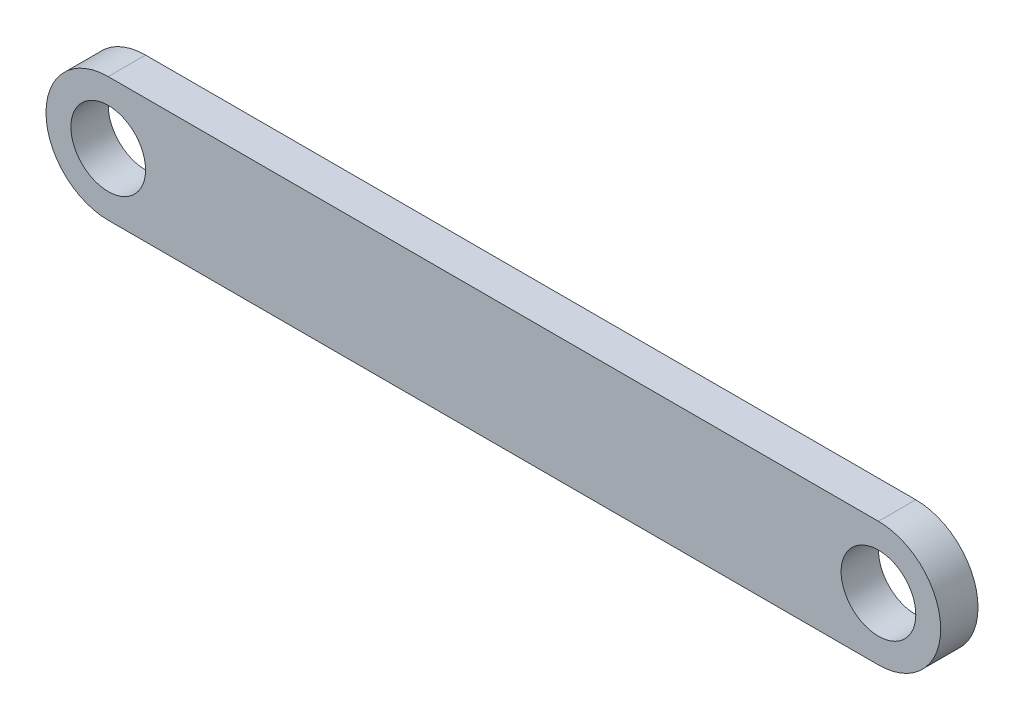
ISO-10303-21;
HEADER;
FILE_DESCRIPTION(('STEP AP214'),'2;1');
FILE_NAME('part.step','',(''),(''),'','','');
FILE_SCHEMA(('AUTOMOTIVE_DESIGN { 1 0 10303 214 1 1 1 1 }'));
ENDSEC;
DATA;
#1=APPLICATION_CONTEXT('core data for automotive mechanical design processes');
#2=APPLICATION_PROTOCOL_DEFINITION('international standard','automotive_design',2000,#1);
#3=PRODUCT_CONTEXT('',#1,'mechanical');
#4=PRODUCT('Part','Part','',(#3));
#5=PRODUCT_RELATED_PRODUCT_CATEGORY('part','',(#4));
#6=PRODUCT_DEFINITION_FORMATION('','',#4);
#7=PRODUCT_DEFINITION_CONTEXT('part definition',#1,'design');
#8=PRODUCT_DEFINITION('design','',#6,#7);
#9=PRODUCT_DEFINITION_SHAPE('','',#8);
#10=(LENGTH_UNIT() NAMED_UNIT(*) SI_UNIT(.MILLI.,.METRE.));
#11=(NAMED_UNIT(*) PLANE_ANGLE_UNIT() SI_UNIT($,.RADIAN.));
#12=(NAMED_UNIT(*) SI_UNIT($,.STERADIAN.) SOLID_ANGLE_UNIT());
#13=UNCERTAINTY_MEASURE_WITH_UNIT(LENGTH_MEASURE(1.E-05),#10,'distance_accuracy_value','');
#14=(GEOMETRIC_REPRESENTATION_CONTEXT(3) GLOBAL_UNCERTAINTY_ASSIGNED_CONTEXT((#13)) GLOBAL_UNIT_ASSIGNED_CONTEXT((#10,
#11,#12)) REPRESENTATION_CONTEXT('',''));
#15=CARTESIAN_POINT('',(0.,0.,0.));
#16=DIRECTION('',(0.,0.,1.));
#17=DIRECTION('',(1.,0.,0.));
#18=AXIS2_PLACEMENT_3D('',#15,#16,#17);
#19=CARTESIAN_POINT('',(-30.95,0.,3.));
#20=DIRECTION('',(0.,0.,1.));
#21=DIRECTION('',(1.,0.,0.));
#22=AXIS2_PLACEMENT_3D('',#19,#20,#21);
#23=PLANE('',#22);
#24=CARTESIAN_POINT('',(-30.95,0.,3.));
#25=DIRECTION('',(0.,0.,1.));
#26=DIRECTION('',(1.,0.,0.));
#27=AXIS2_PLACEMENT_3D('',#24,#25,#26);
#28=CIRCLE('',#27,3.);
#29=CARTESIAN_POINT('',(-27.95,0.,3.));
#30=VERTEX_POINT('',#29);
#31=EDGE_CURVE('E99',#30,#30,#28,.T.);
#32=ORIENTED_EDGE('',*,*,#31,.F.);
#33=EDGE_LOOP('',(#32));
#34=FACE_BOUND('',#33,.T.);
#35=CARTESIAN_POINT('',(-30.95,0.,3.));
#36=DIRECTION('',(0.,0.,1.));
#37=DIRECTION('',(1.,0.,0.));
#38=AXIS2_PLACEMENT_3D('',#35,#36,#37);
#39=CIRCLE('',#38,5.);
#40=CARTESIAN_POINT('',(-30.95,5.,3.));
#41=VERTEX_POINT('',#40);
#42=CARTESIAN_POINT('',(-30.95,-5.,3.));
#43=VERTEX_POINT('',#42);
#44=EDGE_CURVE('E84',#41,#43,#39,.T.);
#45=ORIENTED_EDGE('',*,*,#44,.T.);
#46=DIRECTION('',(1.,0.,0.));
#47=VECTOR('',#46,1.);
#48=CARTESIAN_POINT('',(-30.95,-5.,3.));
#49=LINE('',#48,#47);
#50=CARTESIAN_POINT('',(30.95,-4.99999999999999,3.));
#51=VERTEX_POINT('',#50);
#52=EDGE_CURVE('E79',#43,#51,#49,.T.);
#53=ORIENTED_EDGE('',*,*,#52,.T.);
#54=CARTESIAN_POINT('',(30.95,0.,3.));
#55=DIRECTION('',(0.,0.,1.));
#56=DIRECTION('',(1.,0.,0.));
#57=AXIS2_PLACEMENT_3D('',#54,#55,#56);
#58=CIRCLE('',#57,5.);
#59=CARTESIAN_POINT('',(30.95,5.00000000000001,3.));
#60=VERTEX_POINT('',#59);
#61=EDGE_CURVE('E82',#51,#60,#58,.T.);
#62=ORIENTED_EDGE('',*,*,#61,.T.);
#63=DIRECTION('',(-1.,0.,0.));
#64=VECTOR('',#63,1.);
#65=CARTESIAN_POINT('',(-30.95,5.,3.));
#66=LINE('',#65,#64);
#67=EDGE_CURVE('E49',#60,#41,#66,.T.);
#68=ORIENTED_EDGE('',*,*,#67,.T.);
#69=EDGE_LOOP('',(#45,#53,#62,#68));
#70=FACE_BOUND('',#69,.T.);
#71=CARTESIAN_POINT('',(30.95,0.,3.));
#72=DIRECTION('',(0.,0.,1.));
#73=DIRECTION('',(1.,0.,0.));
#74=AXIS2_PLACEMENT_3D('',#71,#72,#73);
#75=CIRCLE('',#74,3.00000000000001);
#76=CARTESIAN_POINT('',(33.95,0.,3.));
#77=VERTEX_POINT('',#76);
#78=EDGE_CURVE('E114',#77,#77,#75,.T.);
#79=ORIENTED_EDGE('',*,*,#78,.F.);
#80=EDGE_LOOP('',(#79));
#81=FACE_BOUND('',#80,.T.);
#82=ADVANCED_FACE('F32',(#34,#70,#81),#23,.T.);
#83=CARTESIAN_POINT('',(-30.95,0.,0.));
#84=DIRECTION('',(0.,0.,1.));
#85=DIRECTION('',(1.,0.,0.));
#86=AXIS2_PLACEMENT_3D('',#83,#84,#85);
#87=PLANE('',#86);
#88=CARTESIAN_POINT('',(-30.95,0.,0.));
#89=DIRECTION('',(0.,0.,1.));
#90=DIRECTION('',(1.,0.,0.));
#91=AXIS2_PLACEMENT_3D('',#88,#89,#90);
#92=CIRCLE('',#91,5.);
#93=CARTESIAN_POINT('',(-30.95,5.,0.));
#94=VERTEX_POINT('',#93);
#95=CARTESIAN_POINT('',(-30.95,-5.,0.));
#96=VERTEX_POINT('',#95);
#97=EDGE_CURVE('E96',#94,#96,#92,.T.);
#98=ORIENTED_EDGE('',*,*,#97,.F.);
#99=DIRECTION('',(-1.,0.,0.));
#100=VECTOR('',#99,1.);
#101=CARTESIAN_POINT('',(-30.95,5.,0.));
#102=LINE('',#101,#100);
#103=CARTESIAN_POINT('',(30.95,5.00000000000001,0.));
#104=VERTEX_POINT('',#103);
#105=EDGE_CURVE('E72',#104,#94,#102,.T.);
#106=ORIENTED_EDGE('',*,*,#105,.F.);
#107=CARTESIAN_POINT('',(30.95,0.,0.));
#108=DIRECTION('',(0.,0.,1.));
#109=DIRECTION('',(1.,0.,0.));
#110=AXIS2_PLACEMENT_3D('',#107,#108,#109);
#111=CIRCLE('',#110,5.);
#112=CARTESIAN_POINT('',(30.95,-4.99999999999999,0.));
#113=VERTEX_POINT('',#112);
#114=EDGE_CURVE('E66',#113,#104,#111,.T.);
#115=ORIENTED_EDGE('',*,*,#114,.F.);
#116=DIRECTION('',(1.,0.,0.));
#117=VECTOR('',#116,1.);
#118=CARTESIAN_POINT('',(-30.95,-5.,0.));
#119=LINE('',#118,#117);
#120=EDGE_CURVE('E88',#96,#113,#119,.T.);
#121=ORIENTED_EDGE('',*,*,#120,.F.);
#122=EDGE_LOOP('',(#98,#106,#115,#121));
#123=FACE_BOUND('',#122,.T.);
#124=CARTESIAN_POINT('',(-30.95,0.,0.));
#125=DIRECTION('',(0.,0.,1.));
#126=DIRECTION('',(1.,0.,0.));
#127=AXIS2_PLACEMENT_3D('',#124,#125,#126);
#128=CIRCLE('',#127,3.);
#129=CARTESIAN_POINT('',(-27.95,0.,0.));
#130=VERTEX_POINT('',#129);
#131=EDGE_CURVE('E111',#130,#130,#128,.T.);
#132=ORIENTED_EDGE('',*,*,#131,.T.);
#133=EDGE_LOOP('',(#132));
#134=FACE_BOUND('',#133,.T.);
#135=CARTESIAN_POINT('',(30.95,0.,0.));
#136=DIRECTION('',(0.,0.,1.));
#137=DIRECTION('',(1.,0.,0.));
#138=AXIS2_PLACEMENT_3D('',#135,#136,#137);
#139=CIRCLE('',#138,3.00000000000001);
#140=CARTESIAN_POINT('',(33.95,0.,0.));
#141=VERTEX_POINT('',#140);
#142=EDGE_CURVE('E117',#141,#141,#139,.T.);
#143=ORIENTED_EDGE('',*,*,#142,.T.);
#144=EDGE_LOOP('',(#143));
#145=FACE_BOUND('',#144,.T.);
#146=ADVANCED_FACE('F107',(#123,#134,#145),#87,.F.);
#147=CARTESIAN_POINT('',(-30.95,0.,3.));
#148=DIRECTION('',(0.,0.,-1.));
#149=DIRECTION('',(-1.,0.,0.));
#150=AXIS2_PLACEMENT_3D('',#147,#148,#149);
#151=CYLINDRICAL_SURFACE('',#150,5.);
#152=ORIENTED_EDGE('',*,*,#97,.T.);
#153=DIRECTION('',(0.,0.,-1.));
#154=VECTOR('',#153,1.);
#155=CARTESIAN_POINT('',(-30.95,-5.,3.));
#156=LINE('',#155,#154);
#157=EDGE_CURVE('E11',#43,#96,#156,.T.);
#158=ORIENTED_EDGE('',*,*,#157,.F.);
#159=ORIENTED_EDGE('',*,*,#44,.F.);
#160=DIRECTION('',(0.,0.,-1.));
#161=VECTOR('',#160,1.);
#162=CARTESIAN_POINT('',(-30.95,5.,3.));
#163=LINE('',#162,#161);
#164=EDGE_CURVE('E92',#41,#94,#163,.T.);
#165=ORIENTED_EDGE('',*,*,#164,.T.);
#166=EDGE_LOOP('',(#152,#158,#159,#165));
#167=FACE_BOUND('',#166,.T.);
#168=ADVANCED_FACE('F34',(#167),#151,.T.);
#169=CARTESIAN_POINT('',(-30.95,-5.,3.));
#170=DIRECTION('',(0.,1.,0.));
#171=DIRECTION('',(-1.,0.,0.));
#172=AXIS2_PLACEMENT_3D('',#169,#170,#171);
#173=PLANE('',#172);
#174=ORIENTED_EDGE('',*,*,#120,.T.);
#175=DIRECTION('',(0.,0.,-1.));
#176=VECTOR('',#175,1.);
#177=CARTESIAN_POINT('',(30.95,-4.99999999999999,3.));
#178=LINE('',#177,#176);
#179=EDGE_CURVE('E41',#51,#113,#178,.T.);
#180=ORIENTED_EDGE('',*,*,#179,.F.);
#181=ORIENTED_EDGE('',*,*,#52,.F.);
#182=ORIENTED_EDGE('',*,*,#157,.T.);
#183=EDGE_LOOP('',(#174,#180,#181,#182));
#184=FACE_BOUND('',#183,.T.);
#185=ADVANCED_FACE('F87',(#184),#173,.F.);
#186=CARTESIAN_POINT('',(30.95,0.,3.));
#187=DIRECTION('',(0.,0.,-1.));
#188=DIRECTION('',(-1.,0.,0.));
#189=AXIS2_PLACEMENT_3D('',#186,#187,#188);
#190=CYLINDRICAL_SURFACE('',#189,5.);
#191=ORIENTED_EDGE('',*,*,#114,.T.);
#192=DIRECTION('',(0.,0.,-1.));
#193=VECTOR('',#192,1.);
#194=CARTESIAN_POINT('',(30.95,5.00000000000001,3.));
#195=LINE('',#194,#193);
#196=EDGE_CURVE('E89',#60,#104,#195,.T.);
#197=ORIENTED_EDGE('',*,*,#196,.F.);
#198=ORIENTED_EDGE('',*,*,#61,.F.);
#199=ORIENTED_EDGE('',*,*,#179,.T.);
#200=EDGE_LOOP('',(#191,#197,#198,#199));
#201=FACE_BOUND('',#200,.T.);
#202=ADVANCED_FACE('F90',(#201),#190,.T.);
#203=CARTESIAN_POINT('',(-30.95,5.,3.));
#204=DIRECTION('',(0.,-1.,0.));
#205=DIRECTION('',(1.,0.,0.));
#206=AXIS2_PLACEMENT_3D('',#203,#204,#205);
#207=PLANE('',#206);
#208=ORIENTED_EDGE('',*,*,#105,.T.);
#209=ORIENTED_EDGE('',*,*,#164,.F.);
#210=ORIENTED_EDGE('',*,*,#67,.F.);
#211=ORIENTED_EDGE('',*,*,#196,.T.);
#212=EDGE_LOOP('',(#208,#209,#210,#211));
#213=FACE_BOUND('',#212,.T.);
#214=ADVANCED_FACE('F104',(#213),#207,.F.);
#215=CARTESIAN_POINT('',(-30.95,0.,3.));
#216=DIRECTION('',(0.,0.,-1.));
#217=DIRECTION('',(-1.,0.,0.));
#218=AXIS2_PLACEMENT_3D('',#215,#216,#217);
#219=CYLINDRICAL_SURFACE('',#218,3.);
#220=ORIENTED_EDGE('',*,*,#31,.T.);
#221=EDGE_LOOP('',(#220));
#222=FACE_BOUND('',#221,.T.);
#223=ORIENTED_EDGE('',*,*,#131,.F.);
#224=EDGE_LOOP('',(#223));
#225=FACE_BOUND('',#224,.T.);
#226=ADVANCED_FACE('F134',(#222,#225),#219,.F.);
#227=CARTESIAN_POINT('',(30.95,0.,3.));
#228=DIRECTION('',(0.,0.,-1.));
#229=DIRECTION('',(-1.,0.,0.));
#230=AXIS2_PLACEMENT_3D('',#227,#228,#229);
#231=CYLINDRICAL_SURFACE('',#230,3.00000000000001);
#232=ORIENTED_EDGE('',*,*,#78,.T.);
#233=EDGE_LOOP('',(#232));
#234=FACE_BOUND('',#233,.T.);
#235=ORIENTED_EDGE('',*,*,#142,.F.);
#236=EDGE_LOOP('',(#235));
#237=FACE_BOUND('',#236,.T.);
#238=ADVANCED_FACE('F123',(#234,#237),#231,.F.);
#239=CLOSED_SHELL('',(#82,#146,#168,#185,#202,#214,#226,#238));
#240=MANIFOLD_SOLID_BREP('B2',#239);
#241=ADVANCED_BREP_SHAPE_REPRESENTATION('',(#18,#240),#14);
#242=SHAPE_DEFINITION_REPRESENTATION(#9,#241);
ENDSEC;
END-ISO-10303-21;
